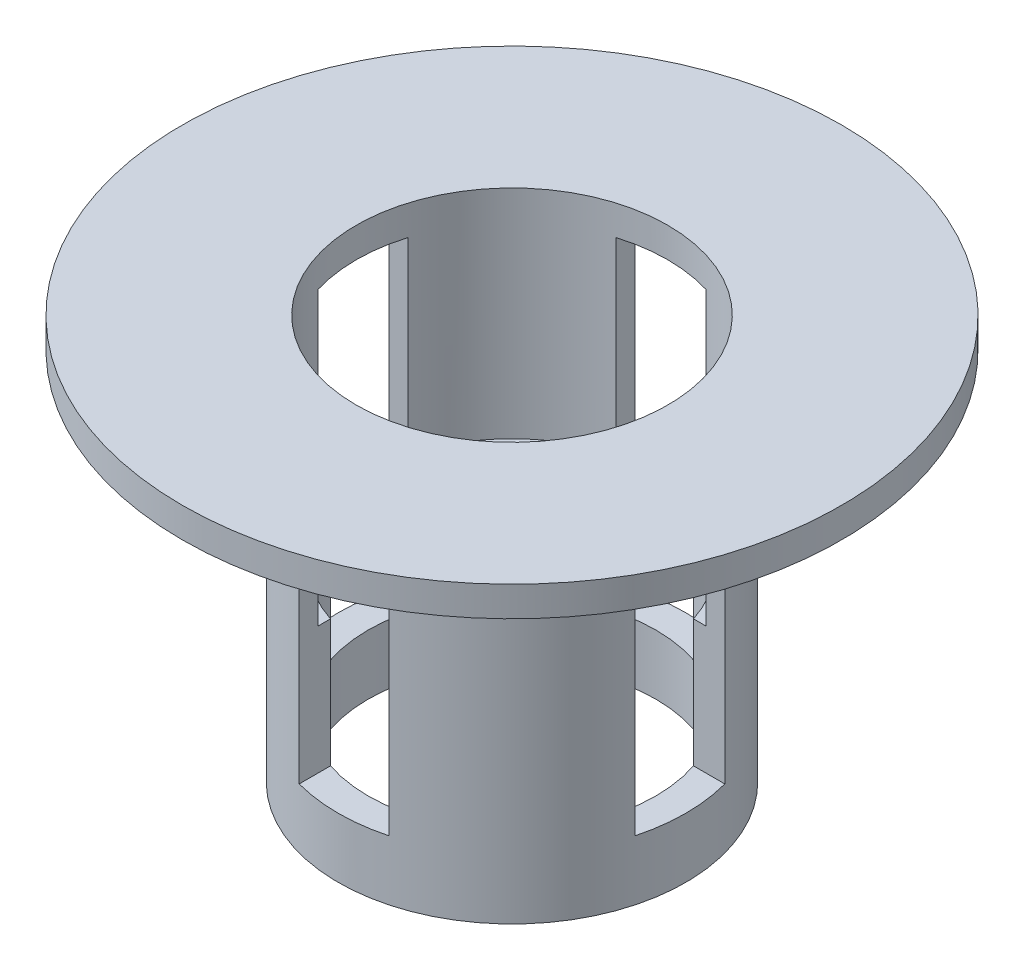
ISO-10303-21;
HEADER;
FILE_DESCRIPTION(('STEP AP214'),'2;1');
FILE_NAME('part.step','',(''),(''),'','','');
FILE_SCHEMA(('AUTOMOTIVE_DESIGN { 1 0 10303 214 1 1 1 1 }'));
ENDSEC;
DATA;
#1=APPLICATION_CONTEXT('core data for automotive mechanical design processes');
#2=APPLICATION_PROTOCOL_DEFINITION('international standard','automotive_design',2000,#1);
#3=PRODUCT_CONTEXT('',#1,'mechanical');
#4=PRODUCT('Part','Part','',(#3));
#5=PRODUCT_RELATED_PRODUCT_CATEGORY('part','',(#4));
#6=PRODUCT_DEFINITION_FORMATION('','',#4);
#7=PRODUCT_DEFINITION_CONTEXT('part definition',#1,'design');
#8=PRODUCT_DEFINITION('design','',#6,#7);
#9=PRODUCT_DEFINITION_SHAPE('','',#8);
#10=(LENGTH_UNIT() NAMED_UNIT(*) SI_UNIT(.MILLI.,.METRE.));
#11=(NAMED_UNIT(*) PLANE_ANGLE_UNIT() SI_UNIT($,.RADIAN.));
#12=(NAMED_UNIT(*) SI_UNIT($,.STERADIAN.) SOLID_ANGLE_UNIT());
#13=UNCERTAINTY_MEASURE_WITH_UNIT(LENGTH_MEASURE(1.E-05),#10,'distance_accuracy_value','');
#14=(GEOMETRIC_REPRESENTATION_CONTEXT(3) GLOBAL_UNCERTAINTY_ASSIGNED_CONTEXT((#13)) GLOBAL_UNIT_ASSIGNED_CONTEXT((#10,
#11,#12)) REPRESENTATION_CONTEXT('',''));
#15=CARTESIAN_POINT('',(0.,0.,0.));
#16=DIRECTION('',(0.,0.,1.));
#17=DIRECTION('',(1.,0.,0.));
#18=AXIS2_PLACEMENT_3D('',#15,#16,#17);
#19=CARTESIAN_POINT('',(0.,-7.9375,0.));
#20=DIRECTION('',(0.,-1.,0.));
#21=DIRECTION('',(0.,0.,-1.));
#22=AXIS2_PLACEMENT_3D('',#19,#20,#21);
#23=PLANE('',#22);
#24=DIRECTION('',(1.,0.,0.));
#25=VECTOR('',#24,1.);
#26=CARTESIAN_POINT('',(0.,-7.9375,1.905));
#27=LINE('',#26,#25);
#28=CARTESIAN_POINT('',(5.79069866251042,-7.9375,1.905));
#29=VERTEX_POINT('',#28);
#30=CARTESIAN_POINT('',(6.32327375652834,-7.9375,1.905));
#31=VERTEX_POINT('',#30);
#32=EDGE_CURVE('E207',#29,#31,#27,.T.);
#33=ORIENTED_EDGE('',*,*,#32,.F.);
#34=CARTESIAN_POINT('',(0.,-7.9375,0.));
#35=DIRECTION('',(0.,-1.,0.));
#36=DIRECTION('',(0.,0.,-1.));
#37=AXIS2_PLACEMENT_3D('',#34,#35,#36);
#38=CIRCLE('',#37,6.096);
#39=CARTESIAN_POINT('',(1.905,-7.9375,5.79069866251042));
#40=VERTEX_POINT('',#39);
#41=EDGE_CURVE('E291',#29,#40,#38,.T.);
#42=ORIENTED_EDGE('',*,*,#41,.T.);
#43=DIRECTION('',(0.,0.,1.));
#44=VECTOR('',#43,1.);
#45=CARTESIAN_POINT('',(1.905,-7.9375,0.));
#46=LINE('',#45,#44);
#47=CARTESIAN_POINT('',(1.905,-7.9375,6.32327375652834));
#48=VERTEX_POINT('',#47);
#49=EDGE_CURVE('E266',#40,#48,#46,.T.);
#50=ORIENTED_EDGE('',*,*,#49,.T.);
#51=CARTESIAN_POINT('',(0.,-7.9375,0.));
#52=DIRECTION('',(0.,-1.,0.));
#53=DIRECTION('',(0.,0.,-1.));
#54=AXIS2_PLACEMENT_3D('',#51,#52,#53);
#55=CIRCLE('',#54,6.604);
#56=EDGE_CURVE('E301',#31,#48,#55,.T.);
#57=ORIENTED_EDGE('',*,*,#56,.F.);
#58=EDGE_LOOP('',(#33,#42,#50,#57));
#59=FACE_BOUND('',#58,.T.);
#60=ADVANCED_FACE('F39',(#59),#23,.F.);
#61=CARTESIAN_POINT('',(0.,1.27,0.));
#62=DIRECTION('',(0.,-1.,0.));
#63=DIRECTION('',(0.,0.,-1.));
#64=AXIS2_PLACEMENT_3D('',#61,#62,#63);
#65=CYLINDRICAL_SURFACE('',#64,6.604);
#66=CARTESIAN_POINT('',(0.,1.27,0.));
#67=DIRECTION('',(0.,1.,0.));
#68=DIRECTION('',(0.,0.,1.));
#69=AXIS2_PLACEMENT_3D('',#66,#67,#68);
#70=CIRCLE('',#69,6.604);
#71=CARTESIAN_POINT('',(0.,1.27,6.604));
#72=VERTEX_POINT('',#71);
#73=EDGE_CURVE('E300',#72,#72,#70,.T.);
#74=ORIENTED_EDGE('',*,*,#73,.T.);
#75=EDGE_LOOP('',(#74));
#76=FACE_BOUND('',#75,.T.);
#77=CARTESIAN_POINT('',(0.,0.,0.));
#78=DIRECTION('',(0.,1.,0.));
#79=DIRECTION('',(-1.,0.,0.));
#80=AXIS2_PLACEMENT_3D('',#77,#78,#79);
#81=CIRCLE('',#80,6.604);
#82=CARTESIAN_POINT('',(6.32327375652834,0.,1.905));
#83=VERTEX_POINT('',#82);
#84=CARTESIAN_POINT('',(6.32327375652834,0.,-1.905));
#85=VERTEX_POINT('',#84);
#86=EDGE_CURVE('E231',#83,#85,#81,.T.);
#87=ORIENTED_EDGE('',*,*,#86,.F.);
#88=DIRECTION('',(0.,-1.,0.));
#89=VECTOR('',#88,1.);
#90=CARTESIAN_POINT('',(6.32327375652834,1.27,1.905));
#91=LINE('',#90,#89);
#92=EDGE_CURVE('E413',#83,#31,#91,.T.);
#93=ORIENTED_EDGE('',*,*,#92,.T.);
#94=ORIENTED_EDGE('',*,*,#56,.T.);
#95=DIRECTION('',(0.,-1.,0.));
#96=VECTOR('',#95,1.);
#97=CARTESIAN_POINT('',(1.905,1.27,6.32327375652834));
#98=LINE('',#97,#96);
#99=CARTESIAN_POINT('',(1.905,0.,6.32327375652834));
#100=VERTEX_POINT('',#99);
#101=EDGE_CURVE('E269',#100,#48,#98,.T.);
#102=ORIENTED_EDGE('',*,*,#101,.F.);
#103=CARTESIAN_POINT('',(0.,0.,0.));
#104=DIRECTION('',(0.,1.,0.));
#105=DIRECTION('',(0.,0.,1.));
#106=AXIS2_PLACEMENT_3D('',#103,#104,#105);
#107=CIRCLE('',#106,6.604);
#108=CARTESIAN_POINT('',(-1.905,0.,6.32327375652834));
#109=VERTEX_POINT('',#108);
#110=EDGE_CURVE('E281',#109,#100,#107,.T.);
#111=ORIENTED_EDGE('',*,*,#110,.F.);
#112=DIRECTION('',(0.,-1.,0.));
#113=VECTOR('',#112,1.);
#114=CARTESIAN_POINT('',(-1.905,1.27,6.32327375652834));
#115=LINE('',#114,#113);
#116=CARTESIAN_POINT('',(-1.905,-7.9375,6.32327375652834));
#117=VERTEX_POINT('',#116);
#118=EDGE_CURVE('E254',#117,#109,#115,.F.);
#119=ORIENTED_EDGE('',*,*,#118,.F.);
#120=CARTESIAN_POINT('',(-6.32327375652834,-7.9375,1.905));
#121=VERTEX_POINT('',#120);
#122=EDGE_CURVE('E302',#117,#121,#55,.T.);
#123=ORIENTED_EDGE('',*,*,#122,.T.);
#124=DIRECTION('',(0.,-1.,0.));
#125=VECTOR('',#124,1.);
#126=CARTESIAN_POINT('',(-6.32327375652834,1.27,1.905));
#127=LINE('',#126,#125);
#128=CARTESIAN_POINT('',(-6.32327375652834,0.,1.905));
#129=VERTEX_POINT('',#128);
#130=EDGE_CURVE('E418',#121,#129,#127,.F.);
#131=ORIENTED_EDGE('',*,*,#130,.T.);
#132=CARTESIAN_POINT('',(-6.32327375652834,0.,-1.905));
#133=VERTEX_POINT('',#132);
#134=EDGE_CURVE('E225',#133,#129,#81,.T.);
#135=ORIENTED_EDGE('',*,*,#134,.F.);
#136=DIRECTION('',(0.,-1.,0.));
#137=VECTOR('',#136,1.);
#138=CARTESIAN_POINT('',(-6.32327375652834,1.27,-1.905));
#139=LINE('',#138,#137);
#140=CARTESIAN_POINT('',(-6.32327375652834,-7.9375,-1.905));
#141=VERTEX_POINT('',#140);
#142=EDGE_CURVE('E406',#141,#133,#139,.F.);
#143=ORIENTED_EDGE('',*,*,#142,.F.);
#144=CARTESIAN_POINT('',(-1.905,-7.9375,-6.32327375652834));
#145=VERTEX_POINT('',#144);
#146=EDGE_CURVE('E296',#141,#145,#55,.T.);
#147=ORIENTED_EDGE('',*,*,#146,.T.);
#148=DIRECTION('',(0.,-1.,0.));
#149=VECTOR('',#148,1.);
#150=CARTESIAN_POINT('',(-1.905,1.27,-6.32327375652834));
#151=LINE('',#150,#149);
#152=CARTESIAN_POINT('',(-1.905,0.,-6.32327375652834));
#153=VERTEX_POINT('',#152);
#154=EDGE_CURVE('E250',#153,#145,#151,.T.);
#155=ORIENTED_EDGE('',*,*,#154,.F.);
#156=CARTESIAN_POINT('',(1.905,0.,-6.32327375652834));
#157=VERTEX_POINT('',#156);
#158=EDGE_CURVE('E283',#157,#153,#107,.T.);
#159=ORIENTED_EDGE('',*,*,#158,.F.);
#160=DIRECTION('',(0.,-1.,0.));
#161=VECTOR('',#160,1.);
#162=CARTESIAN_POINT('',(1.905,1.27,-6.32327375652834));
#163=LINE('',#162,#161);
#164=CARTESIAN_POINT('',(1.905,-7.9375,-6.32327375652834));
#165=VERTEX_POINT('',#164);
#166=EDGE_CURVE('E273',#165,#157,#163,.F.);
#167=ORIENTED_EDGE('',*,*,#166,.F.);
#168=CARTESIAN_POINT('',(6.32327375652834,-7.9375,-1.905));
#169=VERTEX_POINT('',#168);
#170=EDGE_CURVE('E297',#165,#169,#55,.T.);
#171=ORIENTED_EDGE('',*,*,#170,.T.);
#172=DIRECTION('',(0.,-1.,0.));
#173=VECTOR('',#172,1.);
#174=CARTESIAN_POINT('',(6.32327375652834,1.27,-1.905));
#175=LINE('',#174,#173);
#176=EDGE_CURVE('E400',#85,#169,#175,.T.);
#177=ORIENTED_EDGE('',*,*,#176,.F.);
#178=EDGE_LOOP('',(#87,#93,#94,#102,#111,#119,#123,#131,#135,#143,#147,#155,#159,#167,#171,#177));
#179=FACE_BOUND('',#178,.T.);
#180=ADVANCED_FACE('F399',(#76,#179),#65,.F.);
#181=CARTESIAN_POINT('',(0.,-7.9375,0.));
#182=DIRECTION('',(0.,1.,0.));
#183=DIRECTION('',(0.,0.,1.));
#184=AXIS2_PLACEMENT_3D('',#181,#182,#183);
#185=CYLINDRICAL_SURFACE('',#184,7.366);
#186=CARTESIAN_POINT('',(0.,-15.875,0.));
#187=DIRECTION('',(0.,-1.,0.));
#188=DIRECTION('',(0.,0.,-1.));
#189=AXIS2_PLACEMENT_3D('',#186,#187,#188);
#190=CIRCLE('',#189,7.366);
#191=CARTESIAN_POINT('',(0.,-15.875,-7.366));
#192=VERTEX_POINT('',#191);
#193=EDGE_CURVE('E287',#192,#192,#190,.T.);
#194=ORIENTED_EDGE('',*,*,#193,.F.);
#195=EDGE_LOOP('',(#194));
#196=FACE_BOUND('',#195,.T.);
#197=CARTESIAN_POINT('',(0.,-13.335,0.));
#198=DIRECTION('',(0.,1.,0.));
#199=DIRECTION('',(-1.,0.,0.));
#200=AXIS2_PLACEMENT_3D('',#197,#198,#199);
#201=CIRCLE('',#200,7.366);
#202=CARTESIAN_POINT('',(7.11540097253837,-13.335,1.905));
#203=VERTEX_POINT('',#202);
#204=CARTESIAN_POINT('',(7.11540097253837,-13.335,-1.905));
#205=VERTEX_POINT('',#204);
#206=EDGE_CURVE('E54',#203,#205,#201,.T.);
#207=ORIENTED_EDGE('',*,*,#206,.F.);
#208=DIRECTION('',(0.,1.,0.));
#209=VECTOR('',#208,1.);
#210=CARTESIAN_POINT('',(7.11540097253837,-7.9375,1.905));
#211=LINE('',#210,#209);
#212=CARTESIAN_POINT('',(7.11540097253837,0.,1.905));
#213=VERTEX_POINT('',#212);
#214=EDGE_CURVE('E226',#213,#203,#211,.F.);
#215=ORIENTED_EDGE('',*,*,#214,.F.);
#216=CARTESIAN_POINT('',(0.,0.,0.));
#217=DIRECTION('',(0.,1.,0.));
#218=DIRECTION('',(0.,0.,1.));
#219=AXIS2_PLACEMENT_3D('',#216,#217,#218);
#220=CIRCLE('',#219,7.366);
#221=CARTESIAN_POINT('',(1.905,0.,7.11540097253837));
#222=VERTEX_POINT('',#221);
#223=EDGE_CURVE('E309',#213,#222,#220,.F.);
#224=ORIENTED_EDGE('',*,*,#223,.T.);
#225=DIRECTION('',(0.,1.,0.));
#226=VECTOR('',#225,1.);
#227=CARTESIAN_POINT('',(1.905,-7.9375,7.11540097253837));
#228=LINE('',#227,#226);
#229=CARTESIAN_POINT('',(1.905,-13.335,7.11540097253837));
#230=VERTEX_POINT('',#229);
#231=EDGE_CURVE('E275',#222,#230,#228,.F.);
#232=ORIENTED_EDGE('',*,*,#231,.T.);
#233=CARTESIAN_POINT('',(0.,-13.335,0.));
#234=DIRECTION('',(0.,-1.,0.));
#235=DIRECTION('',(0.,0.,-1.));
#236=AXIS2_PLACEMENT_3D('',#233,#234,#235);
#237=CIRCLE('',#236,7.366);
#238=CARTESIAN_POINT('',(-1.905,-13.335,7.11540097253837));
#239=VERTEX_POINT('',#238);
#240=EDGE_CURVE('E265',#230,#239,#237,.T.);
#241=ORIENTED_EDGE('',*,*,#240,.T.);
#242=DIRECTION('',(0.,1.,0.));
#243=VECTOR('',#242,1.);
#244=CARTESIAN_POINT('',(-1.905,-7.9375,7.11540097253837));
#245=LINE('',#244,#243);
#246=CARTESIAN_POINT('',(-1.905,0.,7.11540097253837));
#247=VERTEX_POINT('',#246);
#248=EDGE_CURVE('E259',#239,#247,#245,.T.);
#249=ORIENTED_EDGE('',*,*,#248,.T.);
#250=CARTESIAN_POINT('',(-7.11540097253837,0.,1.905));
#251=VERTEX_POINT('',#250);
#252=EDGE_CURVE('E316',#247,#251,#220,.F.);
#253=ORIENTED_EDGE('',*,*,#252,.T.);
#254=DIRECTION('',(0.,1.,0.));
#255=VECTOR('',#254,1.);
#256=CARTESIAN_POINT('',(-7.11540097253837,-7.9375,1.905));
#257=LINE('',#256,#255);
#258=CARTESIAN_POINT('',(-7.11540097253837,-13.335,1.905));
#259=VERTEX_POINT('',#258);
#260=EDGE_CURVE('E223',#259,#251,#257,.T.);
#261=ORIENTED_EDGE('',*,*,#260,.F.);
#262=CARTESIAN_POINT('',(-7.11540097253837,-13.335,-1.905));
#263=VERTEX_POINT('',#262);
#264=EDGE_CURVE('E213',#263,#259,#201,.T.);
#265=ORIENTED_EDGE('',*,*,#264,.F.);
#266=DIRECTION('',(0.,1.,0.));
#267=VECTOR('',#266,1.);
#268=CARTESIAN_POINT('',(-7.11540097253837,-7.9375,-1.905));
#269=LINE('',#268,#267);
#270=CARTESIAN_POINT('',(-7.11540097253837,0.,-1.905));
#271=VERTEX_POINT('',#270);
#272=EDGE_CURVE('E199',#263,#271,#269,.T.);
#273=ORIENTED_EDGE('',*,*,#272,.T.);
#274=CARTESIAN_POINT('',(-1.905,0.,-7.11540097253837));
#275=VERTEX_POINT('',#274);
#276=EDGE_CURVE('E315',#271,#275,#220,.F.);
#277=ORIENTED_EDGE('',*,*,#276,.T.);
#278=DIRECTION('',(0.,1.,0.));
#279=VECTOR('',#278,1.);
#280=CARTESIAN_POINT('',(-1.905,-7.9375,-7.11540097253837));
#281=LINE('',#280,#279);
#282=CARTESIAN_POINT('',(-1.905,-13.335,-7.11540097253837));
#283=VERTEX_POINT('',#282);
#284=EDGE_CURVE('E256',#275,#283,#281,.F.);
#285=ORIENTED_EDGE('',*,*,#284,.T.);
#286=CARTESIAN_POINT('',(1.905,-13.335,-7.11540097253837));
#287=VERTEX_POINT('',#286);
#288=EDGE_CURVE('E262',#283,#287,#237,.T.);
#289=ORIENTED_EDGE('',*,*,#288,.T.);
#290=DIRECTION('',(0.,1.,0.));
#291=VECTOR('',#290,1.);
#292=CARTESIAN_POINT('',(1.905,-7.9375,-7.11540097253837));
#293=LINE('',#292,#291);
#294=CARTESIAN_POINT('',(1.905,0.,-7.11540097253837));
#295=VERTEX_POINT('',#294);
#296=EDGE_CURVE('E278',#287,#295,#293,.T.);
#297=ORIENTED_EDGE('',*,*,#296,.T.);
#298=CARTESIAN_POINT('',(7.11540097253837,0.,-1.905));
#299=VERTEX_POINT('',#298);
#300=EDGE_CURVE('E312',#295,#299,#220,.F.);
#301=ORIENTED_EDGE('',*,*,#300,.T.);
#302=DIRECTION('',(0.,1.,0.));
#303=VECTOR('',#302,1.);
#304=CARTESIAN_POINT('',(7.11540097253837,-7.9375,-1.905));
#305=LINE('',#304,#303);
#306=EDGE_CURVE('E208',#299,#205,#305,.F.);
#307=ORIENTED_EDGE('',*,*,#306,.T.);
#308=EDGE_LOOP('',(#207,#215,#224,#232,#241,#249,#253,#261,#265,#273,#277,#285,#289,#297,#301,#307));
#309=FACE_BOUND('',#308,.T.);
#310=ADVANCED_FACE('F221',(#196,#309),#185,.T.);
#311=DIRECTION('',(1.,0.,0.));
#312=VECTOR('',#311,1.);
#313=CARTESIAN_POINT('',(0.,-7.9375,1.905));
#314=LINE('',#313,#312);
#315=CARTESIAN_POINT('',(-5.79069866251042,-7.9375,1.905));
#316=VERTEX_POINT('',#315);
#317=EDGE_CURVE('E416',#121,#316,#314,.T.);
#318=ORIENTED_EDGE('',*,*,#317,.F.);
#319=ORIENTED_EDGE('',*,*,#122,.F.);
#320=DIRECTION('',(0.,0.,-1.));
#321=VECTOR('',#320,1.);
#322=CARTESIAN_POINT('',(-1.905,-7.9375,0.));
#323=LINE('',#322,#321);
#324=CARTESIAN_POINT('',(-1.905,-7.9375,5.79069866251042));
#325=VERTEX_POINT('',#324);
#326=EDGE_CURVE('E251',#117,#325,#323,.T.);
#327=ORIENTED_EDGE('',*,*,#326,.T.);
#328=EDGE_CURVE('E293',#325,#316,#38,.T.);
#329=ORIENTED_EDGE('',*,*,#328,.T.);
#330=EDGE_LOOP('',(#318,#319,#327,#329));
#331=FACE_BOUND('',#330,.T.);
#332=ADVANCED_FACE('F446',(#331),#23,.F.);
#333=CARTESIAN_POINT('',(0.,-15.875,0.));
#334=DIRECTION('',(0.,1.,0.));
#335=DIRECTION('',(0.,0.,1.));
#336=AXIS2_PLACEMENT_3D('',#333,#334,#335);
#337=CYLINDRICAL_SURFACE('',#336,6.096);
#338=CARTESIAN_POINT('',(0.,-15.875,0.));
#339=DIRECTION('',(0.,-1.,0.));
#340=DIRECTION('',(0.,0.,-1.));
#341=AXIS2_PLACEMENT_3D('',#338,#339,#340);
#342=CIRCLE('',#341,6.096);
#343=CARTESIAN_POINT('',(0.,-15.875,-6.096));
#344=VERTEX_POINT('',#343);
#345=EDGE_CURVE('E284',#344,#344,#342,.T.);
#346=ORIENTED_EDGE('',*,*,#345,.T.);
#347=EDGE_LOOP('',(#346));
#348=FACE_BOUND('',#347,.T.);
#349=CARTESIAN_POINT('',(0.,-13.335,0.));
#350=DIRECTION('',(0.,1.,0.));
#351=DIRECTION('',(-1.,0.,0.));
#352=AXIS2_PLACEMENT_3D('',#349,#350,#351);
#353=CIRCLE('',#352,6.096);
#354=CARTESIAN_POINT('',(-5.79069866251042,-13.335,-1.905));
#355=VERTEX_POINT('',#354);
#356=CARTESIAN_POINT('',(-5.79069866251042,-13.335,1.905));
#357=VERTEX_POINT('',#356);
#358=EDGE_CURVE('E47',#355,#357,#353,.T.);
#359=ORIENTED_EDGE('',*,*,#358,.T.);
#360=DIRECTION('',(0.,1.,0.));
#361=VECTOR('',#360,1.);
#362=CARTESIAN_POINT('',(-5.79069866251042,-15.875,1.905));
#363=LINE('',#362,#361);
#364=EDGE_CURVE('E12',#357,#316,#363,.T.);
#365=ORIENTED_EDGE('',*,*,#364,.T.);
#366=ORIENTED_EDGE('',*,*,#328,.F.);
#367=DIRECTION('',(0.,1.,0.));
#368=VECTOR('',#367,1.);
#369=CARTESIAN_POINT('',(-1.905,-15.875,5.79069866251042));
#370=LINE('',#369,#368);
#371=CARTESIAN_POINT('',(-1.905,-13.335,5.79069866251042));
#372=VERTEX_POINT('',#371);
#373=EDGE_CURVE('E324',#372,#325,#370,.T.);
#374=ORIENTED_EDGE('',*,*,#373,.F.);
#375=CARTESIAN_POINT('',(0.,-13.335,0.));
#376=DIRECTION('',(0.,-1.,0.));
#377=DIRECTION('',(0.,0.,-1.));
#378=AXIS2_PLACEMENT_3D('',#375,#376,#377);
#379=CIRCLE('',#378,6.096);
#380=CARTESIAN_POINT('',(1.905,-13.335,5.79069866251042));
#381=VERTEX_POINT('',#380);
#382=EDGE_CURVE('E322',#381,#372,#379,.T.);
#383=ORIENTED_EDGE('',*,*,#382,.F.);
#384=DIRECTION('',(0.,1.,0.));
#385=VECTOR('',#384,1.);
#386=CARTESIAN_POINT('',(1.905,-15.875,5.79069866251042));
#387=LINE('',#386,#385);
#388=EDGE_CURVE('E326',#40,#381,#387,.F.);
#389=ORIENTED_EDGE('',*,*,#388,.F.);
#390=ORIENTED_EDGE('',*,*,#41,.F.);
#391=DIRECTION('',(0.,1.,0.));
#392=VECTOR('',#391,1.);
#393=CARTESIAN_POINT('',(5.79069866251042,-15.875,1.905));
#394=LINE('',#393,#392);
#395=CARTESIAN_POINT('',(5.79069866251042,-13.335,1.905));
#396=VERTEX_POINT('',#395);
#397=EDGE_CURVE('E333',#29,#396,#394,.F.);
#398=ORIENTED_EDGE('',*,*,#397,.T.);
#399=CARTESIAN_POINT('',(5.79069866251042,-13.335,-1.905));
#400=VERTEX_POINT('',#399);
#401=EDGE_CURVE('E330',#396,#400,#353,.T.);
#402=ORIENTED_EDGE('',*,*,#401,.T.);
#403=DIRECTION('',(0.,1.,0.));
#404=VECTOR('',#403,1.);
#405=CARTESIAN_POINT('',(5.79069866251042,-15.875,-1.905));
#406=LINE('',#405,#404);
#407=CARTESIAN_POINT('',(5.79069866251042,-7.9375,-1.905));
#408=VERTEX_POINT('',#407);
#409=EDGE_CURVE('E328',#408,#400,#406,.F.);
#410=ORIENTED_EDGE('',*,*,#409,.F.);
#411=CARTESIAN_POINT('',(1.905,-7.9375,-5.79069866251042));
#412=VERTEX_POINT('',#411);
#413=EDGE_CURVE('E288',#412,#408,#38,.T.);
#414=ORIENTED_EDGE('',*,*,#413,.F.);
#415=DIRECTION('',(0.,1.,0.));
#416=VECTOR('',#415,1.);
#417=CARTESIAN_POINT('',(1.905,-15.875,-5.79069866251042));
#418=LINE('',#417,#416);
#419=CARTESIAN_POINT('',(1.905,-13.335,-5.79069866251042));
#420=VERTEX_POINT('',#419);
#421=EDGE_CURVE('E321',#420,#412,#418,.T.);
#422=ORIENTED_EDGE('',*,*,#421,.F.);
#423=CARTESIAN_POINT('',(-1.905,-13.335,-5.79069866251042));
#424=VERTEX_POINT('',#423);
#425=EDGE_CURVE('E319',#424,#420,#379,.T.);
#426=ORIENTED_EDGE('',*,*,#425,.F.);
#427=DIRECTION('',(0.,1.,0.));
#428=VECTOR('',#427,1.);
#429=CARTESIAN_POINT('',(-1.905,-15.875,-5.79069866251042));
#430=LINE('',#429,#428);
#431=CARTESIAN_POINT('',(-1.905,-7.9375,-5.79069866251042));
#432=VERTEX_POINT('',#431);
#433=EDGE_CURVE('E317',#432,#424,#430,.F.);
#434=ORIENTED_EDGE('',*,*,#433,.F.);
#435=CARTESIAN_POINT('',(-5.79069866251042,-7.9375,-1.905));
#436=VERTEX_POINT('',#435);
#437=EDGE_CURVE('E292',#436,#432,#38,.T.);
#438=ORIENTED_EDGE('',*,*,#437,.F.);
#439=DIRECTION('',(0.,1.,0.));
#440=VECTOR('',#439,1.);
#441=CARTESIAN_POINT('',(-5.79069866251042,-15.875,-1.905));
#442=LINE('',#441,#440);
#443=EDGE_CURVE('E335',#355,#436,#442,.T.);
#444=ORIENTED_EDGE('',*,*,#443,.F.);
#445=EDGE_LOOP('',(#359,#365,#366,#374,#383,#389,#390,#398,#402,#410,#414,#422,#426,#434,#438,#444));
#446=FACE_BOUND('',#445,.T.);
#447=ADVANCED_FACE('F338',(#348,#446),#337,.F.);
#448=ORIENTED_EDGE('',*,*,#413,.T.);
#449=DIRECTION('',(1.,0.,0.));
#450=VECTOR('',#449,1.);
#451=CARTESIAN_POINT('',(0.,-7.9375,-1.905));
#452=LINE('',#451,#450);
#453=EDGE_CURVE('E395',#408,#169,#452,.T.);
#454=ORIENTED_EDGE('',*,*,#453,.T.);
#455=ORIENTED_EDGE('',*,*,#170,.F.);
#456=EDGE_CURVE('E270',#165,#412,#46,.T.);
#457=ORIENTED_EDGE('',*,*,#456,.T.);
#458=EDGE_LOOP('',(#448,#454,#455,#457));
#459=FACE_BOUND('',#458,.T.);
#460=ADVANCED_FACE('F393',(#459),#23,.F.);
#461=CARTESIAN_POINT('',(0.,0.,0.));
#462=DIRECTION('',(0.,1.,0.));
#463=DIRECTION('',(0.,0.,1.));
#464=AXIS2_PLACEMENT_3D('',#461,#462,#463);
#465=PLANE('',#464);
#466=ORIENTED_EDGE('',*,*,#223,.F.);
#467=DIRECTION('',(1.,0.,0.));
#468=VECTOR('',#467,1.);
#469=CARTESIAN_POINT('',(-13.97,0.,1.905));
#470=LINE('',#469,#468);
#471=EDGE_CURVE('E424',#83,#213,#470,.T.);
#472=ORIENTED_EDGE('',*,*,#471,.F.);
#473=ORIENTED_EDGE('',*,*,#86,.T.);
#474=DIRECTION('',(1.,0.,0.));
#475=VECTOR('',#474,1.);
#476=CARTESIAN_POINT('',(-13.97,0.,-1.905));
#477=LINE('',#476,#475);
#478=EDGE_CURVE('E217',#85,#299,#477,.T.);
#479=ORIENTED_EDGE('',*,*,#478,.T.);
#480=ORIENTED_EDGE('',*,*,#300,.F.);
#481=DIRECTION('',(0.,0.,1.));
#482=VECTOR('',#481,1.);
#483=CARTESIAN_POINT('',(1.905,0.,-13.97));
#484=LINE('',#483,#482);
#485=EDGE_CURVE('E243',#295,#157,#484,.T.);
#486=ORIENTED_EDGE('',*,*,#485,.T.);
#487=ORIENTED_EDGE('',*,*,#158,.T.);
#488=DIRECTION('',(0.,0.,1.));
#489=VECTOR('',#488,1.);
#490=CARTESIAN_POINT('',(-1.905,0.,-13.97));
#491=LINE('',#490,#489);
#492=EDGE_CURVE('E240',#275,#153,#491,.T.);
#493=ORIENTED_EDGE('',*,*,#492,.F.);
#494=ORIENTED_EDGE('',*,*,#276,.F.);
#495=EDGE_CURVE('E62',#271,#133,#477,.T.);
#496=ORIENTED_EDGE('',*,*,#495,.T.);
#497=ORIENTED_EDGE('',*,*,#134,.T.);
#498=EDGE_CURVE('E427',#251,#129,#470,.T.);
#499=ORIENTED_EDGE('',*,*,#498,.F.);
#500=ORIENTED_EDGE('',*,*,#252,.F.);
#501=EDGE_CURVE('E241',#109,#247,#491,.T.);
#502=ORIENTED_EDGE('',*,*,#501,.F.);
#503=ORIENTED_EDGE('',*,*,#110,.T.);
#504=EDGE_CURVE('E244',#100,#222,#484,.T.);
#505=ORIENTED_EDGE('',*,*,#504,.T.);
#506=EDGE_LOOP('',(#466,#472,#473,#479,#480,#486,#487,#493,#494,#496,#497,#499,#500,#502,#503,#505));
#507=FACE_BOUND('',#506,.T.);
#508=CARTESIAN_POINT('',(0.,0.,0.));
#509=DIRECTION('',(0.,1.,0.));
#510=DIRECTION('',(0.,0.,1.));
#511=AXIS2_PLACEMENT_3D('',#508,#509,#510);
#512=CIRCLE('',#511,13.97);
#513=CARTESIAN_POINT('',(0.,0.,13.97));
#514=VERTEX_POINT('',#513);
#515=EDGE_CURVE('E305',#514,#514,#512,.T.);
#516=ORIENTED_EDGE('',*,*,#515,.F.);
#517=EDGE_LOOP('',(#516));
#518=FACE_BOUND('',#517,.T.);
#519=ADVANCED_FACE('F371',(#507,#518),#465,.F.);
#520=CARTESIAN_POINT('',(0.,1.27,0.));
#521=DIRECTION('',(0.,1.,0.));
#522=DIRECTION('',(0.,0.,1.));
#523=AXIS2_PLACEMENT_3D('',#520,#521,#522);
#524=PLANE('',#523);
#525=CARTESIAN_POINT('',(0.,1.27,0.));
#526=DIRECTION('',(0.,1.,0.));
#527=DIRECTION('',(0.,0.,1.));
#528=AXIS2_PLACEMENT_3D('',#525,#526,#527);
#529=CIRCLE('',#528,13.97);
#530=CARTESIAN_POINT('',(0.,1.27,13.97));
#531=VERTEX_POINT('',#530);
#532=EDGE_CURVE('E306',#531,#531,#529,.T.);
#533=ORIENTED_EDGE('',*,*,#532,.T.);
#534=EDGE_LOOP('',(#533));
#535=FACE_BOUND('',#534,.T.);
#536=ORIENTED_EDGE('',*,*,#73,.F.);
#537=EDGE_LOOP('',(#536));
#538=FACE_BOUND('',#537,.T.);
#539=ADVANCED_FACE('F479',(#535,#538),#524,.T.);
#540=CARTESIAN_POINT('',(0.,1.27,0.));
#541=DIRECTION('',(0.,-1.,0.));
#542=DIRECTION('',(0.,0.,-1.));
#543=AXIS2_PLACEMENT_3D('',#540,#541,#542);
#544=CYLINDRICAL_SURFACE('',#543,13.97);
#545=ORIENTED_EDGE('',*,*,#532,.F.);
#546=EDGE_LOOP('',(#545));
#547=FACE_BOUND('',#546,.T.);
#548=ORIENTED_EDGE('',*,*,#515,.T.);
#549=EDGE_LOOP('',(#548));
#550=FACE_BOUND('',#549,.T.);
#551=ADVANCED_FACE('F41',(#547,#550),#544,.T.);
#552=ORIENTED_EDGE('',*,*,#146,.F.);
#553=DIRECTION('',(1.,0.,0.));
#554=VECTOR('',#553,1.);
#555=CARTESIAN_POINT('',(0.,-7.9375,-1.905));
#556=LINE('',#555,#554);
#557=EDGE_CURVE('E408',#141,#436,#556,.T.);
#558=ORIENTED_EDGE('',*,*,#557,.T.);
#559=ORIENTED_EDGE('',*,*,#437,.T.);
#560=EDGE_CURVE('E247',#432,#145,#323,.T.);
#561=ORIENTED_EDGE('',*,*,#560,.T.);
#562=EDGE_LOOP('',(#552,#558,#559,#561));
#563=FACE_BOUND('',#562,.T.);
#564=ADVANCED_FACE('F435',(#563),#23,.F.);
#565=CARTESIAN_POINT('',(0.,-15.875,0.));
#566=DIRECTION('',(0.,-1.,0.));
#567=DIRECTION('',(0.,0.,-1.));
#568=AXIS2_PLACEMENT_3D('',#565,#566,#567);
#569=PLANE('',#568);
#570=ORIENTED_EDGE('',*,*,#193,.T.);
#571=EDGE_LOOP('',(#570));
#572=FACE_BOUND('',#571,.T.);
#573=ORIENTED_EDGE('',*,*,#345,.F.);
#574=EDGE_LOOP('',(#573));
#575=FACE_BOUND('',#574,.T.);
#576=ADVANCED_FACE('F473',(#572,#575),#569,.T.);
#577=CARTESIAN_POINT('',(-1.905,-13.335,-13.97));
#578=DIRECTION('',(-1.,0.,0.));
#579=DIRECTION('',(0.,0.,1.));
#580=AXIS2_PLACEMENT_3D('',#577,#578,#579);
#581=PLANE('',#580);
#582=ORIENTED_EDGE('',*,*,#492,.T.);
#583=ORIENTED_EDGE('',*,*,#154,.T.);
#584=ORIENTED_EDGE('',*,*,#560,.F.);
#585=ORIENTED_EDGE('',*,*,#433,.T.);
#586=DIRECTION('',(0.,0.,1.));
#587=VECTOR('',#586,1.);
#588=CARTESIAN_POINT('',(-1.905,-13.335,-13.97));
#589=LINE('',#588,#587);
#590=EDGE_CURVE('E236',#283,#424,#589,.T.);
#591=ORIENTED_EDGE('',*,*,#590,.F.);
#592=ORIENTED_EDGE('',*,*,#284,.F.);
#593=EDGE_LOOP('',(#582,#583,#584,#585,#591,#592));
#594=FACE_BOUND('',#593,.T.);
#595=ADVANCED_FACE('F378',(#594),#581,.F.);
#596=CARTESIAN_POINT('',(1.905,-13.335,-13.97));
#597=DIRECTION('',(0.,-1.,0.));
#598=DIRECTION('',(0.,0.,-1.));
#599=AXIS2_PLACEMENT_3D('',#596,#597,#598);
#600=PLANE('',#599);
#601=ORIENTED_EDGE('',*,*,#590,.T.);
#602=ORIENTED_EDGE('',*,*,#425,.T.);
#603=DIRECTION('',(0.,0.,1.));
#604=VECTOR('',#603,1.);
#605=CARTESIAN_POINT('',(1.905,-13.335,-13.97));
#606=LINE('',#605,#604);
#607=EDGE_CURVE('E235',#287,#420,#606,.T.);
#608=ORIENTED_EDGE('',*,*,#607,.F.);
#609=ORIENTED_EDGE('',*,*,#288,.F.);
#610=EDGE_LOOP('',(#601,#602,#608,#609));
#611=FACE_BOUND('',#610,.T.);
#612=ADVANCED_FACE('F381',(#611),#600,.F.);
#613=CARTESIAN_POINT('',(1.905,-13.335,-13.97));
#614=DIRECTION('',(1.,0.,0.));
#615=DIRECTION('',(0.,0.,-1.));
#616=AXIS2_PLACEMENT_3D('',#613,#614,#615);
#617=PLANE('',#616);
#618=ORIENTED_EDGE('',*,*,#607,.T.);
#619=ORIENTED_EDGE('',*,*,#421,.T.);
#620=ORIENTED_EDGE('',*,*,#456,.F.);
#621=ORIENTED_EDGE('',*,*,#166,.T.);
#622=ORIENTED_EDGE('',*,*,#485,.F.);
#623=ORIENTED_EDGE('',*,*,#296,.F.);
#624=EDGE_LOOP('',(#618,#619,#620,#621,#622,#623));
#625=FACE_BOUND('',#624,.T.);
#626=ADVANCED_FACE('F389',(#625),#617,.F.);
#627=ORIENTED_EDGE('',*,*,#504,.F.);
#628=ORIENTED_EDGE('',*,*,#101,.T.);
#629=ORIENTED_EDGE('',*,*,#49,.F.);
#630=ORIENTED_EDGE('',*,*,#388,.T.);
#631=EDGE_CURVE('E232',#381,#230,#606,.T.);
#632=ORIENTED_EDGE('',*,*,#631,.T.);
#633=ORIENTED_EDGE('',*,*,#231,.F.);
#634=EDGE_LOOP('',(#627,#628,#629,#630,#632,#633));
#635=FACE_BOUND('',#634,.T.);
#636=ADVANCED_FACE('F354',(#635),#617,.F.);
#637=ORIENTED_EDGE('',*,*,#631,.F.);
#638=ORIENTED_EDGE('',*,*,#382,.T.);
#639=EDGE_CURVE('E237',#372,#239,#589,.T.);
#640=ORIENTED_EDGE('',*,*,#639,.T.);
#641=ORIENTED_EDGE('',*,*,#240,.F.);
#642=EDGE_LOOP('',(#637,#638,#640,#641));
#643=FACE_BOUND('',#642,.T.);
#644=ADVANCED_FACE('F361',(#643),#600,.F.);
#645=ORIENTED_EDGE('',*,*,#639,.F.);
#646=ORIENTED_EDGE('',*,*,#373,.T.);
#647=ORIENTED_EDGE('',*,*,#326,.F.);
#648=ORIENTED_EDGE('',*,*,#118,.T.);
#649=ORIENTED_EDGE('',*,*,#501,.T.);
#650=ORIENTED_EDGE('',*,*,#248,.F.);
#651=EDGE_LOOP('',(#645,#646,#647,#648,#649,#650));
#652=FACE_BOUND('',#651,.T.);
#653=ADVANCED_FACE('F452',(#652),#581,.F.);
#654=CARTESIAN_POINT('',(-13.97,-13.335,-1.905));
#655=DIRECTION('',(0.,0.,-1.));
#656=DIRECTION('',(0.,1.,0.));
#657=AXIS2_PLACEMENT_3D('',#654,#655,#656);
#658=PLANE('',#657);
#659=ORIENTED_EDGE('',*,*,#478,.F.);
#660=ORIENTED_EDGE('',*,*,#176,.T.);
#661=ORIENTED_EDGE('',*,*,#453,.F.);
#662=ORIENTED_EDGE('',*,*,#409,.T.);
#663=DIRECTION('',(1.,0.,0.));
#664=VECTOR('',#663,1.);
#665=CARTESIAN_POINT('',(-13.97,-13.335,-1.905));
#666=LINE('',#665,#664);
#667=EDGE_CURVE('E218',#400,#205,#666,.T.);
#668=ORIENTED_EDGE('',*,*,#667,.T.);
#669=ORIENTED_EDGE('',*,*,#306,.F.);
#670=EDGE_LOOP('',(#659,#660,#661,#662,#668,#669));
#671=FACE_BOUND('',#670,.T.);
#672=ADVANCED_FACE('F450',(#671),#658,.F.);
#673=CARTESIAN_POINT('',(-13.97,-13.335,1.905));
#674=DIRECTION('',(0.,0.,-1.));
#675=DIRECTION('',(-1.,0.,0.));
#676=AXIS2_PLACEMENT_3D('',#673,#674,#675);
#677=PLANE('',#676);
#678=ORIENTED_EDGE('',*,*,#214,.T.);
#679=DIRECTION('',(1.,0.,0.));
#680=VECTOR('',#679,1.);
#681=CARTESIAN_POINT('',(-13.97,-13.335,1.905));
#682=LINE('',#681,#680);
#683=EDGE_CURVE('E423',#396,#203,#682,.T.);
#684=ORIENTED_EDGE('',*,*,#683,.F.);
#685=ORIENTED_EDGE('',*,*,#397,.F.);
#686=ORIENTED_EDGE('',*,*,#32,.T.);
#687=ORIENTED_EDGE('',*,*,#92,.F.);
#688=ORIENTED_EDGE('',*,*,#471,.T.);
#689=EDGE_LOOP('',(#678,#684,#685,#686,#687,#688));
#690=FACE_BOUND('',#689,.T.);
#691=ADVANCED_FACE('F422',(#690),#677,.T.);
#692=CARTESIAN_POINT('',(-13.97,-13.335,-1.905));
#693=DIRECTION('',(0.,1.,0.));
#694=DIRECTION('',(-1.,0.,0.));
#695=AXIS2_PLACEMENT_3D('',#692,#693,#694);
#696=PLANE('',#695);
#697=ORIENTED_EDGE('',*,*,#206,.T.);
#698=ORIENTED_EDGE('',*,*,#667,.F.);
#699=ORIENTED_EDGE('',*,*,#401,.F.);
#700=ORIENTED_EDGE('',*,*,#683,.T.);
#701=EDGE_LOOP('',(#697,#698,#699,#700));
#702=FACE_BOUND('',#701,.T.);
#703=ADVANCED_FACE('F425',(#702),#696,.T.);
#704=ORIENTED_EDGE('',*,*,#264,.T.);
#705=EDGE_CURVE('E426',#259,#357,#682,.T.);
#706=ORIENTED_EDGE('',*,*,#705,.T.);
#707=ORIENTED_EDGE('',*,*,#358,.F.);
#708=EDGE_CURVE('E202',#263,#355,#666,.T.);
#709=ORIENTED_EDGE('',*,*,#708,.F.);
#710=EDGE_LOOP('',(#704,#706,#707,#709));
#711=FACE_BOUND('',#710,.T.);
#712=ADVANCED_FACE('F211',(#711),#696,.T.);
#713=ORIENTED_EDGE('',*,*,#260,.T.);
#714=ORIENTED_EDGE('',*,*,#498,.T.);
#715=ORIENTED_EDGE('',*,*,#130,.F.);
#716=ORIENTED_EDGE('',*,*,#317,.T.);
#717=ORIENTED_EDGE('',*,*,#364,.F.);
#718=ORIENTED_EDGE('',*,*,#705,.F.);
#719=EDGE_LOOP('',(#713,#714,#715,#716,#717,#718));
#720=FACE_BOUND('',#719,.T.);
#721=ADVANCED_FACE('F442',(#720),#677,.T.);
#722=ORIENTED_EDGE('',*,*,#708,.T.);
#723=ORIENTED_EDGE('',*,*,#443,.T.);
#724=ORIENTED_EDGE('',*,*,#557,.F.);
#725=ORIENTED_EDGE('',*,*,#142,.T.);
#726=ORIENTED_EDGE('',*,*,#495,.F.);
#727=ORIENTED_EDGE('',*,*,#272,.F.);
#728=EDGE_LOOP('',(#722,#723,#724,#725,#726,#727));
#729=FACE_BOUND('',#728,.T.);
#730=ADVANCED_FACE('F201',(#729),#658,.F.);
#731=CLOSED_SHELL('',(#60,#180,#310,#332,#447,#460,#519,#539,#551,#564,#576,#595,#612,#626,#636,
#644,#653,#672,#691,#703,#712,#721,#730));
#732=MANIFOLD_SOLID_BREP('B2',#731);
#733=ADVANCED_BREP_SHAPE_REPRESENTATION('',(#18,#732),#14);
#734=SHAPE_DEFINITION_REPRESENTATION(#9,#733);
ENDSEC;
END-ISO-10303-21;
